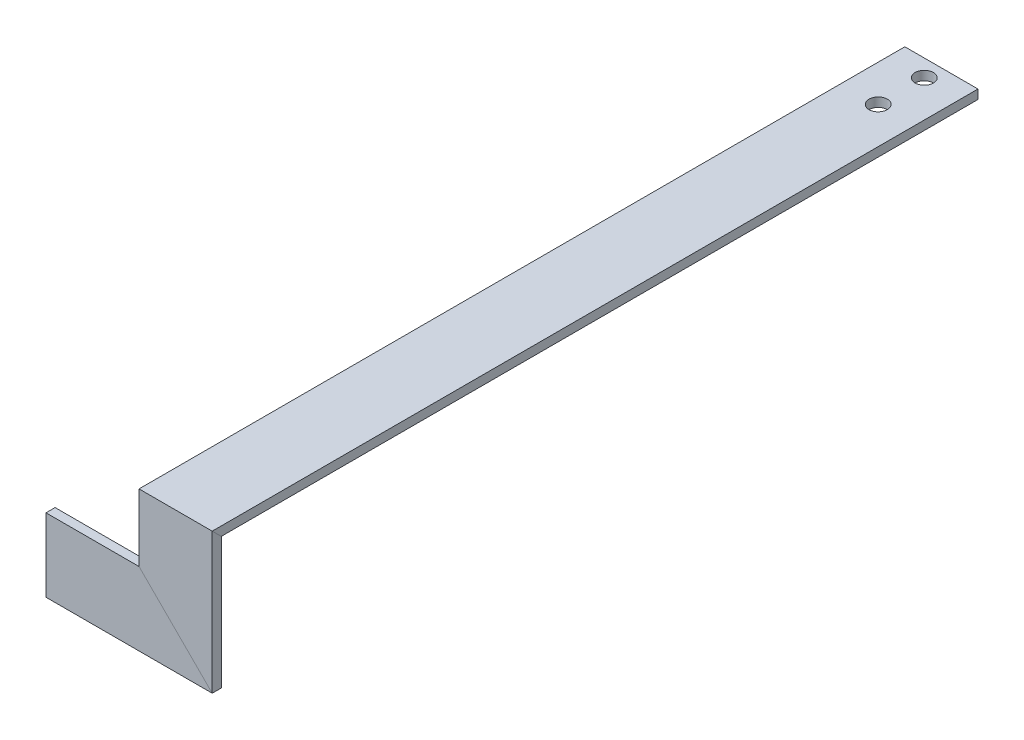
ISO-10303-21;
HEADER;
FILE_DESCRIPTION(('STEP AP214'),'2;1');
FILE_NAME('part.step','',(''),(''),'','','');
FILE_SCHEMA(('AUTOMOTIVE_DESIGN { 1 0 10303 214 1 1 1 1 }'));
ENDSEC;
DATA;
#1=APPLICATION_CONTEXT('core data for automotive mechanical design processes');
#2=APPLICATION_PROTOCOL_DEFINITION('international standard','automotive_design',2000,#1);
#3=PRODUCT_CONTEXT('',#1,'mechanical');
#4=PRODUCT('Part','Part','',(#3));
#5=PRODUCT_RELATED_PRODUCT_CATEGORY('part','',(#4));
#6=PRODUCT_DEFINITION_FORMATION('','',#4);
#7=PRODUCT_DEFINITION_CONTEXT('part definition',#1,'design');
#8=PRODUCT_DEFINITION('design','',#6,#7);
#9=PRODUCT_DEFINITION_SHAPE('','',#8);
#10=(LENGTH_UNIT() NAMED_UNIT(*) SI_UNIT(.MILLI.,.METRE.));
#11=(NAMED_UNIT(*) PLANE_ANGLE_UNIT() SI_UNIT($,.RADIAN.));
#12=(NAMED_UNIT(*) SI_UNIT($,.STERADIAN.) SOLID_ANGLE_UNIT());
#13=UNCERTAINTY_MEASURE_WITH_UNIT(LENGTH_MEASURE(1.E-05),#10,'distance_accuracy_value','');
#14=(GEOMETRIC_REPRESENTATION_CONTEXT(3) GLOBAL_UNCERTAINTY_ASSIGNED_CONTEXT((#13)) GLOBAL_UNIT_ASSIGNED_CONTEXT((#10,
#11,#12)) REPRESENTATION_CONTEXT('',''));
#15=CARTESIAN_POINT('',(0.,0.,0.));
#16=DIRECTION('',(0.,0.,1.));
#17=DIRECTION('',(1.,0.,0.));
#18=AXIS2_PLACEMENT_3D('',#15,#16,#17);
#19=CARTESIAN_POINT('',(-90.,-68.92,528.55));
#20=DIRECTION('',(-1.,0.,0.));
#21=DIRECTION('',(0.,-1.,0.));
#22=AXIS2_PLACEMENT_3D('',#19,#20,#21);
#23=PLANE('',#22);
#24=DIRECTION('',(0.,0.,1.));
#25=VECTOR('',#24,1.);
#26=CARTESIAN_POINT('',(-90.,-94.32,531.705));
#27=LINE('',#26,#25);
#28=CARTESIAN_POINT('',(-90.,-94.32,525.395));
#29=VERTEX_POINT('',#28);
#30=CARTESIAN_POINT('',(-90.,-94.32,531.705));
#31=VERTEX_POINT('',#30);
#32=EDGE_CURVE('E84',#29,#31,#27,.T.);
#33=ORIENTED_EDGE('',*,*,#32,.T.);
#34=DIRECTION('',(0.,1.,0.));
#35=VECTOR('',#34,1.);
#36=CARTESIAN_POINT('',(-90.,-43.52,531.705));
#37=LINE('',#36,#35);
#38=CARTESIAN_POINT('',(-90.,-43.52,531.705));
#39=VERTEX_POINT('',#38);
#40=EDGE_CURVE('E82',#31,#39,#37,.T.);
#41=ORIENTED_EDGE('',*,*,#40,.T.);
#42=DIRECTION('',(0.,0.,-1.));
#43=VECTOR('',#42,1.);
#44=CARTESIAN_POINT('',(-90.,-43.52,531.705));
#45=LINE('',#44,#43);
#46=CARTESIAN_POINT('',(-90.,-43.52,525.395));
#47=VERTEX_POINT('',#46);
#48=EDGE_CURVE('E79',#39,#47,#45,.T.);
#49=ORIENTED_EDGE('',*,*,#48,.T.);
#50=DIRECTION('',(0.,-1.,0.));
#51=VECTOR('',#50,1.);
#52=CARTESIAN_POINT('',(-90.,-43.52,525.395));
#53=LINE('',#52,#51);
#54=EDGE_CURVE('E99',#47,#29,#53,.T.);
#55=ORIENTED_EDGE('',*,*,#54,.T.);
#56=EDGE_LOOP('',(#33,#41,#49,#55));
#57=FACE_BOUND('',#56,.T.);
#58=ADVANCED_FACE('F33',(#57),#23,.T.);
#59=CARTESIAN_POINT('',(0.,0.,0.));
#60=DIRECTION('',(0.,0.,1.));
#61=DIRECTION('',(1.,0.,0.));
#62=AXIS2_PLACEMENT_3D('',#59,#60,#61);
#63=PLANE('',#62);
#64=DIRECTION('',(0.,1.,0.));
#65=VECTOR('',#64,1.);
#66=CARTESIAN_POINT('',(25.4,3.155,0.));
#67=LINE('',#66,#65);
#68=CARTESIAN_POINT('',(25.4,-3.155,0.));
#69=VERTEX_POINT('',#68);
#70=CARTESIAN_POINT('',(25.4,3.155,0.));
#71=VERTEX_POINT('',#70);
#72=EDGE_CURVE('E141',#69,#71,#67,.T.);
#73=ORIENTED_EDGE('',*,*,#72,.F.);
#74=DIRECTION('',(1.,0.,0.));
#75=VECTOR('',#74,1.);
#76=CARTESIAN_POINT('',(-25.4,-3.155,0.));
#77=LINE('',#76,#75);
#78=CARTESIAN_POINT('',(-25.4,-3.155,0.));
#79=VERTEX_POINT('',#78);
#80=EDGE_CURVE('E147',#79,#69,#77,.T.);
#81=ORIENTED_EDGE('',*,*,#80,.F.);
#82=DIRECTION('',(0.,-1.,0.));
#83=VECTOR('',#82,1.);
#84=CARTESIAN_POINT('',(-25.4,3.155,0.));
#85=LINE('',#84,#83);
#86=CARTESIAN_POINT('',(-25.4,3.155,0.));
#87=VERTEX_POINT('',#86);
#88=EDGE_CURVE('E131',#87,#79,#85,.T.);
#89=ORIENTED_EDGE('',*,*,#88,.F.);
#90=DIRECTION('',(-1.,0.,0.));
#91=VECTOR('',#90,1.);
#92=CARTESIAN_POINT('',(-25.4,3.155,0.));
#93=LINE('',#92,#91);
#94=EDGE_CURVE('E137',#71,#87,#93,.T.);
#95=ORIENTED_EDGE('',*,*,#94,.F.);
#96=EDGE_LOOP('',(#73,#81,#89,#95));
#97=FACE_BOUND('',#96,.T.);
#98=ADVANCED_FACE('F334',(#97),#63,.F.);
#99=CARTESIAN_POINT('',(28.04,-43.52,531.705));
#100=DIRECTION('',(0.,1.,0.));
#101=DIRECTION('',(0.,0.,1.));
#102=AXIS2_PLACEMENT_3D('',#99,#100,#101);
#103=PLANE('',#102);
#104=DIRECTION('',(0.,0.,1.));
#105=VECTOR('',#104,1.);
#106=CARTESIAN_POINT('',(-25.4,-43.52,531.705));
#107=LINE('',#106,#105);
#108=CARTESIAN_POINT('',(-25.4,-43.52,525.395));
#109=VERTEX_POINT('',#108);
#110=CARTESIAN_POINT('',(-25.4,-43.52,531.705));
#111=VERTEX_POINT('',#110);
#112=EDGE_CURVE('E115',#109,#111,#107,.T.);
#113=ORIENTED_EDGE('',*,*,#112,.F.);
#114=DIRECTION('',(-1.,0.,0.));
#115=VECTOR('',#114,1.);
#116=CARTESIAN_POINT('',(28.04,-43.52,525.395));
#117=LINE('',#116,#115);
#118=EDGE_CURVE('E97',#109,#47,#117,.T.);
#119=ORIENTED_EDGE('',*,*,#118,.T.);
#120=ORIENTED_EDGE('',*,*,#48,.F.);
#121=DIRECTION('',(-1.,0.,0.));
#122=VECTOR('',#121,1.);
#123=CARTESIAN_POINT('',(28.04,-43.52,531.705));
#124=LINE('',#123,#122);
#125=EDGE_CURVE('E36',#111,#39,#124,.T.);
#126=ORIENTED_EDGE('',*,*,#125,.F.);
#127=EDGE_LOOP('',(#113,#119,#120,#126));
#128=FACE_BOUND('',#127,.T.);
#129=ADVANCED_FACE('F94',(#128),#103,.T.);
#130=CARTESIAN_POINT('',(28.04,-43.52,525.395));
#131=DIRECTION('',(0.,0.,-1.));
#132=DIRECTION('',(-1.,0.,0.));
#133=AXIS2_PLACEMENT_3D('',#130,#131,#132);
#134=PLANE('',#133);
#135=DIRECTION('',(-0.707106781186548,0.707106781186548,0.));
#136=VECTOR('',#135,1.);
#137=CARTESIAN_POINT('',(-48.94525,-19.97475,525.395));
#138=LINE('',#137,#136);
#139=CARTESIAN_POINT('',(25.4,-94.32,525.395));
#140=VERTEX_POINT('',#139);
#141=EDGE_CURVE('E128',#140,#109,#138,.T.);
#142=ORIENTED_EDGE('',*,*,#141,.F.);
#143=DIRECTION('',(-1.,0.,0.));
#144=VECTOR('',#143,1.);
#145=CARTESIAN_POINT('',(28.04,-94.32,525.395));
#146=LINE('',#145,#144);
#147=EDGE_CURVE('E108',#140,#29,#146,.T.);
#148=ORIENTED_EDGE('',*,*,#147,.T.);
#149=ORIENTED_EDGE('',*,*,#54,.F.);
#150=ORIENTED_EDGE('',*,*,#118,.F.);
#151=EDGE_LOOP('',(#142,#148,#149,#150));
#152=FACE_BOUND('',#151,.T.);
#153=ADVANCED_FACE('F317',(#152),#134,.T.);
#154=CARTESIAN_POINT('',(28.04,-94.32,531.705));
#155=DIRECTION('',(0.,-1.,0.));
#156=DIRECTION('',(0.,0.,-1.));
#157=AXIS2_PLACEMENT_3D('',#154,#155,#156);
#158=PLANE('',#157);
#159=DIRECTION('',(0.,0.,-1.));
#160=VECTOR('',#159,1.);
#161=CARTESIAN_POINT('',(25.4,-94.32,531.705));
#162=LINE('',#161,#160);
#163=CARTESIAN_POINT('',(25.4,-94.32,531.705));
#164=VERTEX_POINT('',#163);
#165=EDGE_CURVE('E125',#164,#140,#162,.T.);
#166=ORIENTED_EDGE('',*,*,#165,.F.);
#167=DIRECTION('',(-1.,0.,0.));
#168=VECTOR('',#167,1.);
#169=CARTESIAN_POINT('',(28.04,-94.32,531.705));
#170=LINE('',#169,#168);
#171=EDGE_CURVE('E98',#164,#31,#170,.T.);
#172=ORIENTED_EDGE('',*,*,#171,.T.);
#173=ORIENTED_EDGE('',*,*,#32,.F.);
#174=ORIENTED_EDGE('',*,*,#147,.F.);
#175=EDGE_LOOP('',(#166,#172,#173,#174));
#176=FACE_BOUND('',#175,.T.);
#177=ADVANCED_FACE('F232',(#176),#158,.T.);
#178=CARTESIAN_POINT('',(28.04,-43.52,531.705));
#179=DIRECTION('',(0.,0.,1.));
#180=DIRECTION('',(1.,0.,0.));
#181=AXIS2_PLACEMENT_3D('',#178,#179,#180);
#182=PLANE('',#181);
#183=DIRECTION('',(0.707106781186548,-0.707106781186548,0.));
#184=VECTOR('',#183,1.);
#185=CARTESIAN_POINT('',(-48.94525,-19.97475,531.705));
#186=LINE('',#185,#184);
#187=EDGE_CURVE('E103',#111,#164,#186,.T.);
#188=ORIENTED_EDGE('',*,*,#187,.F.);
#189=ORIENTED_EDGE('',*,*,#125,.T.);
#190=ORIENTED_EDGE('',*,*,#40,.F.);
#191=ORIENTED_EDGE('',*,*,#171,.F.);
#192=EDGE_LOOP('',(#188,#189,#190,#191));
#193=FACE_BOUND('',#192,.T.);
#194=ADVANCED_FACE('F101',(#193),#182,.T.);
#195=CARTESIAN_POINT('',(-25.4,3.5704999999999,531.705));
#196=DIRECTION('',(0.,0.,1.));
#197=DIRECTION('',(1.,0.,0.));
#198=AXIS2_PLACEMENT_3D('',#195,#196,#197);
#199=PLANE('',#198);
#200=DIRECTION('',(0.,-1.,0.));
#201=VECTOR('',#200,1.);
#202=CARTESIAN_POINT('',(-25.4,3.5704999999999,531.705));
#203=LINE('',#202,#201);
#204=CARTESIAN_POINT('',(-25.4,3.15499999999998,531.705));
#205=VERTEX_POINT('',#204);
#206=EDGE_CURVE('E117',#205,#111,#203,.T.);
#207=ORIENTED_EDGE('',*,*,#206,.T.);
#208=ORIENTED_EDGE('',*,*,#187,.T.);
#209=DIRECTION('',(0.,-1.,0.));
#210=VECTOR('',#209,1.);
#211=CARTESIAN_POINT('',(25.4,3.5704999999999,531.705));
#212=LINE('',#211,#210);
#213=CARTESIAN_POINT('',(25.4,3.15499999999998,531.705));
#214=VERTEX_POINT('',#213);
#215=EDGE_CURVE('E104',#214,#164,#212,.T.);
#216=ORIENTED_EDGE('',*,*,#215,.F.);
#217=DIRECTION('',(1.,0.,0.));
#218=VECTOR('',#217,1.);
#219=CARTESIAN_POINT('',(-25.4,3.155,531.705));
#220=LINE('',#219,#218);
#221=EDGE_CURVE('E135',#205,#214,#220,.T.);
#222=ORIENTED_EDGE('',*,*,#221,.F.);
#223=EDGE_LOOP('',(#207,#208,#216,#222));
#224=FACE_BOUND('',#223,.T.);
#225=ADVANCED_FACE('F224',(#224),#199,.T.);
#226=CARTESIAN_POINT('',(25.4,3.5704999999999,531.705));
#227=DIRECTION('',(1.,0.,0.));
#228=DIRECTION('',(0.,0.,-1.));
#229=AXIS2_PLACEMENT_3D('',#226,#227,#228);
#230=PLANE('',#229);
#231=ORIENTED_EDGE('',*,*,#215,.T.);
#232=ORIENTED_EDGE('',*,*,#165,.T.);
#233=DIRECTION('',(0.,-1.,0.));
#234=VECTOR('',#233,1.);
#235=CARTESIAN_POINT('',(25.4,3.5704999999999,525.395));
#236=LINE('',#235,#234);
#237=CARTESIAN_POINT('',(25.4,-3.15500000000007,525.395));
#238=VERTEX_POINT('',#237);
#239=EDGE_CURVE('E106',#238,#140,#236,.T.);
#240=ORIENTED_EDGE('',*,*,#239,.F.);
#241=DIRECTION('',(0.,-0.707106781186548,-0.707106781186548));
#242=VECTOR('',#241,1.);
#243=CARTESIAN_POINT('',(25.4,-262.6975,265.8525));
#244=LINE('',#243,#242);
#245=EDGE_CURVE('E42',#214,#238,#244,.T.);
#246=ORIENTED_EDGE('',*,*,#245,.F.);
#247=EDGE_LOOP('',(#231,#232,#240,#246));
#248=FACE_BOUND('',#247,.T.);
#249=ADVANCED_FACE('F222',(#248),#230,.T.);
#250=CARTESIAN_POINT('',(-25.4,3.5704999999999,525.395));
#251=DIRECTION('',(0.,0.,-1.));
#252=DIRECTION('',(-1.,0.,0.));
#253=AXIS2_PLACEMENT_3D('',#250,#251,#252);
#254=PLANE('',#253);
#255=ORIENTED_EDGE('',*,*,#239,.T.);
#256=ORIENTED_EDGE('',*,*,#141,.T.);
#257=DIRECTION('',(0.,-1.,0.));
#258=VECTOR('',#257,1.);
#259=CARTESIAN_POINT('',(-25.4,3.5704999999999,525.395));
#260=LINE('',#259,#258);
#261=CARTESIAN_POINT('',(-25.4,-3.15500000000005,525.395));
#262=VERTEX_POINT('',#261);
#263=EDGE_CURVE('E120',#262,#109,#260,.T.);
#264=ORIENTED_EDGE('',*,*,#263,.F.);
#265=DIRECTION('',(-1.,0.,0.));
#266=VECTOR('',#265,1.);
#267=CARTESIAN_POINT('',(-25.4,-3.155,525.395));
#268=LINE('',#267,#266);
#269=EDGE_CURVE('E11',#238,#262,#268,.T.);
#270=ORIENTED_EDGE('',*,*,#269,.F.);
#271=EDGE_LOOP('',(#255,#256,#264,#270));
#272=FACE_BOUND('',#271,.T.);
#273=ADVANCED_FACE('F216',(#272),#254,.T.);
#274=CARTESIAN_POINT('',(-25.4,3.5704999999999,531.705));
#275=DIRECTION('',(-1.,0.,0.));
#276=DIRECTION('',(0.,0.,1.));
#277=AXIS2_PLACEMENT_3D('',#274,#275,#276);
#278=PLANE('',#277);
#279=ORIENTED_EDGE('',*,*,#263,.T.);
#280=ORIENTED_EDGE('',*,*,#112,.T.);
#281=ORIENTED_EDGE('',*,*,#206,.F.);
#282=DIRECTION('',(0.,0.707106781186548,0.707106781186548));
#283=VECTOR('',#282,1.);
#284=CARTESIAN_POINT('',(-25.4,-262.6975,265.8525));
#285=LINE('',#284,#283);
#286=EDGE_CURVE('E132',#262,#205,#285,.T.);
#287=ORIENTED_EDGE('',*,*,#286,.F.);
#288=EDGE_LOOP('',(#279,#280,#281,#287));
#289=FACE_BOUND('',#288,.T.);
#290=ADVANCED_FACE('F189',(#289),#278,.T.);
#291=CARTESIAN_POINT('',(-25.4,3.155,0.));
#292=DIRECTION('',(0.,1.,0.));
#293=DIRECTION('',(0.,0.,1.));
#294=AXIS2_PLACEMENT_3D('',#291,#292,#293);
#295=PLANE('',#294);
#296=CARTESIAN_POINT('',(6.7168492989822E-12,3.155,11.892204665723));
#297=DIRECTION('',(0.,1.,0.));
#298=DIRECTION('',(0.,0.,1.));
#299=AXIS2_PLACEMENT_3D('',#296,#297,#298);
#300=CIRCLE('',#299,6.35000000000002);
#301=CARTESIAN_POINT('',(6.7168492989822E-12,3.155,18.2422046657231));
#302=VERTEX_POINT('',#301);
#303=EDGE_CURVE('E169',#302,#302,#300,.T.);
#304=ORIENTED_EDGE('',*,*,#303,.F.);
#305=EDGE_LOOP('',(#304));
#306=FACE_BOUND('',#305,.T.);
#307=CARTESIAN_POINT('',(6.82787160144471E-12,3.155,43.8922046657231));
#308=DIRECTION('',(0.,1.,0.));
#309=DIRECTION('',(0.,0.,1.));
#310=AXIS2_PLACEMENT_3D('',#307,#308,#309);
#311=CIRCLE('',#310,6.35000000000002);
#312=CARTESIAN_POINT('',(6.82787160144471E-12,3.155,50.2422046657231));
#313=VERTEX_POINT('',#312);
#314=EDGE_CURVE('E163',#313,#313,#311,.T.);
#315=ORIENTED_EDGE('',*,*,#314,.F.);
#316=EDGE_LOOP('',(#315));
#317=FACE_BOUND('',#316,.T.);
#318=DIRECTION('',(0.,0.,1.));
#319=VECTOR('',#318,1.);
#320=CARTESIAN_POINT('',(-25.4,3.155,0.));
#321=LINE('',#320,#319);
#322=EDGE_CURVE('E140',#87,#205,#321,.T.);
#323=ORIENTED_EDGE('',*,*,#322,.T.);
#324=ORIENTED_EDGE('',*,*,#221,.T.);
#325=DIRECTION('',(0.,0.,1.));
#326=VECTOR('',#325,1.);
#327=CARTESIAN_POINT('',(25.4,3.155,0.));
#328=LINE('',#327,#326);
#329=EDGE_CURVE('E136',#71,#214,#328,.T.);
#330=ORIENTED_EDGE('',*,*,#329,.F.);
#331=ORIENTED_EDGE('',*,*,#94,.T.);
#332=EDGE_LOOP('',(#323,#324,#330,#331));
#333=FACE_BOUND('',#332,.T.);
#334=ADVANCED_FACE('F185',(#306,#317,#333),#295,.T.);
#335=CARTESIAN_POINT('',(25.4,3.155,0.));
#336=DIRECTION('',(1.,0.,0.));
#337=DIRECTION('',(0.,0.,-1.));
#338=AXIS2_PLACEMENT_3D('',#335,#336,#337);
#339=PLANE('',#338);
#340=ORIENTED_EDGE('',*,*,#329,.T.);
#341=ORIENTED_EDGE('',*,*,#245,.T.);
#342=DIRECTION('',(0.,0.,1.));
#343=VECTOR('',#342,1.);
#344=CARTESIAN_POINT('',(25.4,-3.155,0.));
#345=LINE('',#344,#343);
#346=EDGE_CURVE('E144',#69,#238,#345,.T.);
#347=ORIENTED_EDGE('',*,*,#346,.F.);
#348=ORIENTED_EDGE('',*,*,#72,.T.);
#349=EDGE_LOOP('',(#340,#341,#347,#348));
#350=FACE_BOUND('',#349,.T.);
#351=ADVANCED_FACE('F188',(#350),#339,.T.);
#352=CARTESIAN_POINT('',(-25.4,-3.155,0.));
#353=DIRECTION('',(0.,-1.,0.));
#354=DIRECTION('',(0.,0.,-1.));
#355=AXIS2_PLACEMENT_3D('',#352,#353,#354);
#356=PLANE('',#355);
#357=CARTESIAN_POINT('',(6.7168492989822E-12,-3.155,11.892204665723));
#358=DIRECTION('',(0.,1.,0.));
#359=DIRECTION('',(0.,0.,1.));
#360=AXIS2_PLACEMENT_3D('',#357,#358,#359);
#361=CIRCLE('',#360,6.35000000000002);
#362=CARTESIAN_POINT('',(6.7168492989822E-12,-3.155,18.2422046657231));
#363=VERTEX_POINT('',#362);
#364=EDGE_CURVE('E166',#363,#363,#361,.T.);
#365=ORIENTED_EDGE('',*,*,#364,.T.);
#366=EDGE_LOOP('',(#365));
#367=FACE_BOUND('',#366,.T.);
#368=CARTESIAN_POINT('',(6.82787160144471E-12,-3.155,43.8922046657231));
#369=DIRECTION('',(0.,1.,0.));
#370=DIRECTION('',(0.,0.,1.));
#371=AXIS2_PLACEMENT_3D('',#368,#369,#370);
#372=CIRCLE('',#371,6.35000000000002);
#373=CARTESIAN_POINT('',(6.82787160144471E-12,-3.155,50.2422046657231));
#374=VERTEX_POINT('',#373);
#375=EDGE_CURVE('E89',#374,#374,#372,.T.);
#376=ORIENTED_EDGE('',*,*,#375,.T.);
#377=EDGE_LOOP('',(#376));
#378=FACE_BOUND('',#377,.T.);
#379=ORIENTED_EDGE('',*,*,#346,.T.);
#380=ORIENTED_EDGE('',*,*,#269,.T.);
#381=DIRECTION('',(0.,0.,1.));
#382=VECTOR('',#381,1.);
#383=CARTESIAN_POINT('',(-25.4,-3.155,0.));
#384=LINE('',#383,#382);
#385=EDGE_CURVE('E150',#79,#262,#384,.T.);
#386=ORIENTED_EDGE('',*,*,#385,.F.);
#387=ORIENTED_EDGE('',*,*,#80,.T.);
#388=EDGE_LOOP('',(#379,#380,#386,#387));
#389=FACE_BOUND('',#388,.T.);
#390=ADVANCED_FACE('F175',(#367,#378,#389),#356,.T.);
#391=CARTESIAN_POINT('',(-25.4,3.155,0.));
#392=DIRECTION('',(-1.,0.,0.));
#393=DIRECTION('',(0.,0.,1.));
#394=AXIS2_PLACEMENT_3D('',#391,#392,#393);
#395=PLANE('',#394);
#396=ORIENTED_EDGE('',*,*,#385,.T.);
#397=ORIENTED_EDGE('',*,*,#286,.T.);
#398=ORIENTED_EDGE('',*,*,#322,.F.);
#399=ORIENTED_EDGE('',*,*,#88,.T.);
#400=EDGE_LOOP('',(#396,#397,#398,#399));
#401=FACE_BOUND('',#400,.T.);
#402=ADVANCED_FACE('F199',(#401),#395,.T.);
#403=CARTESIAN_POINT('',(6.82787160144471E-12,-3.155,43.8922046657231));
#404=DIRECTION('',(0.,1.,0.));
#405=DIRECTION('',(0.,0.,1.));
#406=AXIS2_PLACEMENT_3D('',#403,#404,#405);
#407=CYLINDRICAL_SURFACE('',#406,6.35000000000002);
#408=ORIENTED_EDGE('',*,*,#375,.F.);
#409=EDGE_LOOP('',(#408));
#410=FACE_BOUND('',#409,.T.);
#411=ORIENTED_EDGE('',*,*,#314,.T.);
#412=EDGE_LOOP('',(#411));
#413=FACE_BOUND('',#412,.T.);
#414=ADVANCED_FACE('F181',(#410,#413),#407,.F.);
#415=CARTESIAN_POINT('',(6.7168492989822E-12,-3.155,11.892204665723));
#416=DIRECTION('',(0.,1.,0.));
#417=DIRECTION('',(0.,0.,1.));
#418=AXIS2_PLACEMENT_3D('',#415,#416,#417);
#419=CYLINDRICAL_SURFACE('',#418,6.35000000000002);
#420=ORIENTED_EDGE('',*,*,#364,.F.);
#421=EDGE_LOOP('',(#420));
#422=FACE_BOUND('',#421,.T.);
#423=ORIENTED_EDGE('',*,*,#303,.T.);
#424=EDGE_LOOP('',(#423));
#425=FACE_BOUND('',#424,.T.);
#426=ADVANCED_FACE('F178',(#422,#425),#419,.F.);
#427=CLOSED_SHELL('',(#58,#98,#129,#153,#177,#194,#225,#249,#273,#290,#334,#351,#390,#402,#414,#426));
#428=MANIFOLD_SOLID_BREP('B2',#427);
#429=ADVANCED_BREP_SHAPE_REPRESENTATION('',(#18,#428),#14);
#430=SHAPE_DEFINITION_REPRESENTATION(#9,#429);
ENDSEC;
END-ISO-10303-21;
